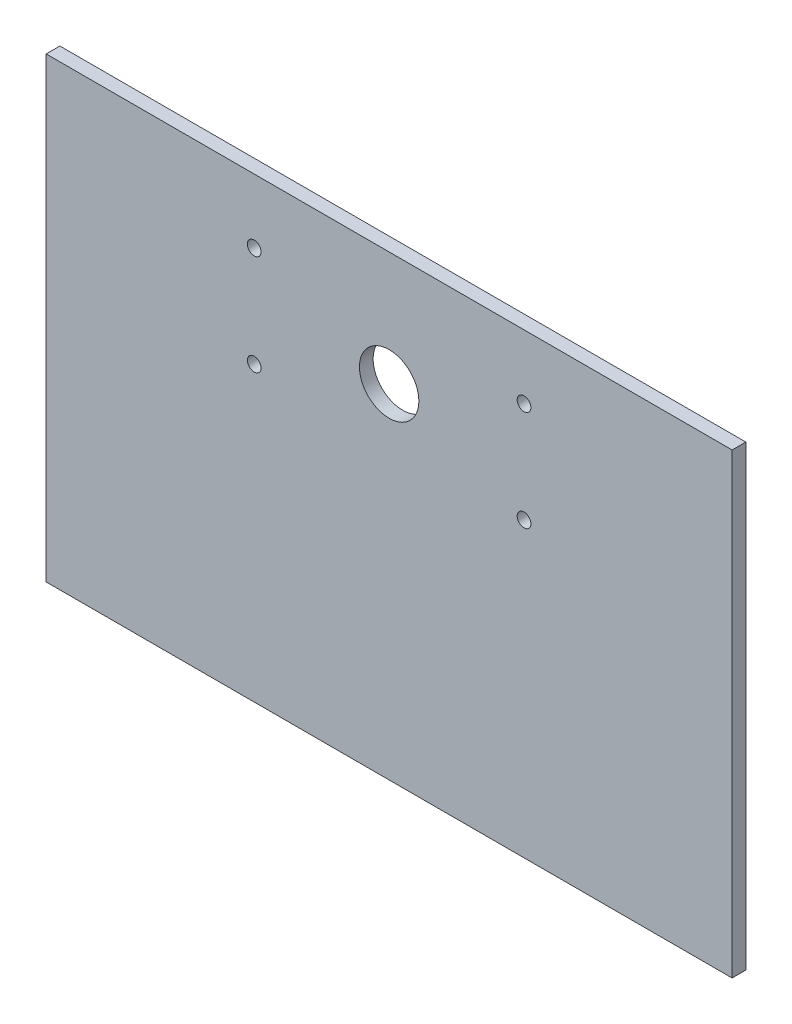
ISO-10303-21;
HEADER;
FILE_DESCRIPTION(('STEP AP214'),'2;1');
FILE_NAME('part.step','',(''),(''),'','','');
FILE_SCHEMA(('AUTOMOTIVE_DESIGN { 1 0 10303 214 1 1 1 1 }'));
ENDSEC;
DATA;
#1=APPLICATION_CONTEXT('core data for automotive mechanical design processes');
#2=APPLICATION_PROTOCOL_DEFINITION('international standard','automotive_design',2000,#1);
#3=PRODUCT_CONTEXT('',#1,'mechanical');
#4=PRODUCT('Part','Part','',(#3));
#5=PRODUCT_RELATED_PRODUCT_CATEGORY('part','',(#4));
#6=PRODUCT_DEFINITION_FORMATION('','',#4);
#7=PRODUCT_DEFINITION_CONTEXT('part definition',#1,'design');
#8=PRODUCT_DEFINITION('design','',#6,#7);
#9=PRODUCT_DEFINITION_SHAPE('','',#8);
#10=(LENGTH_UNIT() NAMED_UNIT(*) SI_UNIT(.MILLI.,.METRE.));
#11=(NAMED_UNIT(*) PLANE_ANGLE_UNIT() SI_UNIT($,.RADIAN.));
#12=(NAMED_UNIT(*) SI_UNIT($,.STERADIAN.) SOLID_ANGLE_UNIT());
#13=UNCERTAINTY_MEASURE_WITH_UNIT(LENGTH_MEASURE(1.E-05),#10,'distance_accuracy_value','');
#14=(GEOMETRIC_REPRESENTATION_CONTEXT(3) GLOBAL_UNCERTAINTY_ASSIGNED_CONTEXT((#13)) GLOBAL_UNIT_ASSIGNED_CONTEXT((#10,
#11,#12)) REPRESENTATION_CONTEXT('',''));
#15=CARTESIAN_POINT('',(0.,0.,0.));
#16=DIRECTION('',(0.,0.,1.));
#17=DIRECTION('',(1.,0.,0.));
#18=AXIS2_PLACEMENT_3D('',#15,#16,#17);
#19=CARTESIAN_POINT('',(0.,0.,3.));
#20=DIRECTION('',(0.,0.,1.));
#21=DIRECTION('',(1.,0.,0.));
#22=AXIS2_PLACEMENT_3D('',#19,#20,#21);
#23=PLANE('',#22);
#24=CARTESIAN_POINT('',(45.5,64.,3.));
#25=DIRECTION('',(0.,0.,1.));
#26=DIRECTION('',(1.,0.,0.));
#27=AXIS2_PLACEMENT_3D('',#24,#25,#26);
#28=CIRCLE('',#27,1.5);
#29=CARTESIAN_POINT('',(47.,64.,3.));
#30=VERTEX_POINT('',#29);
#31=EDGE_CURVE('E127',#30,#30,#28,.T.);
#32=ORIENTED_EDGE('',*,*,#31,.F.);
#33=EDGE_LOOP('',(#32));
#34=FACE_BOUND('',#33,.T.);
#35=CARTESIAN_POINT('',(104.5,86.,3.));
#36=DIRECTION('',(0.,0.,1.));
#37=DIRECTION('',(1.,0.,0.));
#38=AXIS2_PLACEMENT_3D('',#35,#36,#37);
#39=CIRCLE('',#38,1.5);
#40=CARTESIAN_POINT('',(106.,86.,3.));
#41=VERTEX_POINT('',#40);
#42=EDGE_CURVE('E115',#41,#41,#39,.T.);
#43=ORIENTED_EDGE('',*,*,#42,.F.);
#44=EDGE_LOOP('',(#43));
#45=FACE_BOUND('',#44,.T.);
#46=DIRECTION('',(0.,-1.,0.));
#47=VECTOR('',#46,1.);
#48=CARTESIAN_POINT('',(0.,100.,3.));
#49=LINE('',#48,#47);
#50=CARTESIAN_POINT('',(0.,100.,3.));
#51=VERTEX_POINT('',#50);
#52=CARTESIAN_POINT('',(0.,0.,3.));
#53=VERTEX_POINT('',#52);
#54=EDGE_CURVE('E85',#51,#53,#49,.T.);
#55=ORIENTED_EDGE('',*,*,#54,.T.);
#56=DIRECTION('',(1.,0.,0.));
#57=VECTOR('',#56,1.);
#58=CARTESIAN_POINT('',(0.,0.,3.));
#59=LINE('',#58,#57);
#60=CARTESIAN_POINT('',(150.,0.,3.));
#61=VERTEX_POINT('',#60);
#62=EDGE_CURVE('E80',#53,#61,#59,.T.);
#63=ORIENTED_EDGE('',*,*,#62,.T.);
#64=DIRECTION('',(0.,1.,0.));
#65=VECTOR('',#64,1.);
#66=CARTESIAN_POINT('',(150.,100.,3.));
#67=LINE('',#66,#65);
#68=CARTESIAN_POINT('',(150.,100.,3.));
#69=VERTEX_POINT('',#68);
#70=EDGE_CURVE('E83',#61,#69,#67,.T.);
#71=ORIENTED_EDGE('',*,*,#70,.T.);
#72=DIRECTION('',(-1.,0.,0.));
#73=VECTOR('',#72,1.);
#74=CARTESIAN_POINT('',(0.,100.,3.));
#75=LINE('',#74,#73);
#76=EDGE_CURVE('E50',#69,#51,#75,.T.);
#77=ORIENTED_EDGE('',*,*,#76,.T.);
#78=EDGE_LOOP('',(#55,#63,#71,#77));
#79=FACE_BOUND('',#78,.T.);
#80=CARTESIAN_POINT('',(75.,75.,3.));
#81=DIRECTION('',(0.,0.,1.));
#82=DIRECTION('',(1.,0.,0.));
#83=AXIS2_PLACEMENT_3D('',#80,#81,#82);
#84=CIRCLE('',#83,6.49999999999998);
#85=CARTESIAN_POINT('',(81.5,75.,3.));
#86=VERTEX_POINT('',#85);
#87=EDGE_CURVE('E100',#86,#86,#84,.T.);
#88=ORIENTED_EDGE('',*,*,#87,.F.);
#89=EDGE_LOOP('',(#88));
#90=FACE_BOUND('',#89,.T.);
#91=CARTESIAN_POINT('',(104.5,64.,3.));
#92=DIRECTION('',(0.,0.,1.));
#93=DIRECTION('',(-1.,0.,0.));
#94=AXIS2_PLACEMENT_3D('',#91,#92,#93);
#95=CIRCLE('',#94,1.5);
#96=CARTESIAN_POINT('',(103.,64.,3.));
#97=VERTEX_POINT('',#96);
#98=EDGE_CURVE('E121',#97,#97,#95,.T.);
#99=ORIENTED_EDGE('',*,*,#98,.F.);
#100=EDGE_LOOP('',(#99));
#101=FACE_BOUND('',#100,.T.);
#102=CARTESIAN_POINT('',(45.5,86.,3.));
#103=DIRECTION('',(0.,0.,1.));
#104=DIRECTION('',(-1.,0.,0.));
#105=AXIS2_PLACEMENT_3D('',#102,#103,#104);
#106=CIRCLE('',#105,1.5);
#107=CARTESIAN_POINT('',(44.,86.,3.));
#108=VERTEX_POINT('',#107);
#109=EDGE_CURVE('E133',#108,#108,#106,.T.);
#110=ORIENTED_EDGE('',*,*,#109,.F.);
#111=EDGE_LOOP('',(#110));
#112=FACE_BOUND('',#111,.T.);
#113=ADVANCED_FACE('F33',(#34,#45,#79,#90,#101,#112),#23,.T.);
#114=CARTESIAN_POINT('',(0.,0.,0.));
#115=DIRECTION('',(0.,0.,1.));
#116=DIRECTION('',(1.,0.,0.));
#117=AXIS2_PLACEMENT_3D('',#114,#115,#116);
#118=PLANE('',#117);
#119=DIRECTION('',(0.,-1.,0.));
#120=VECTOR('',#119,1.);
#121=CARTESIAN_POINT('',(0.,100.,0.));
#122=LINE('',#121,#120);
#123=CARTESIAN_POINT('',(0.,100.,0.));
#124=VERTEX_POINT('',#123);
#125=CARTESIAN_POINT('',(0.,0.,0.));
#126=VERTEX_POINT('',#125);
#127=EDGE_CURVE('E97',#124,#126,#122,.T.);
#128=ORIENTED_EDGE('',*,*,#127,.F.);
#129=DIRECTION('',(-1.,0.,0.));
#130=VECTOR('',#129,1.);
#131=CARTESIAN_POINT('',(0.,100.,0.));
#132=LINE('',#131,#130);
#133=CARTESIAN_POINT('',(150.,100.,0.));
#134=VERTEX_POINT('',#133);
#135=EDGE_CURVE('E73',#134,#124,#132,.T.);
#136=ORIENTED_EDGE('',*,*,#135,.F.);
#137=DIRECTION('',(0.,1.,0.));
#138=VECTOR('',#137,1.);
#139=CARTESIAN_POINT('',(150.,100.,0.));
#140=LINE('',#139,#138);
#141=CARTESIAN_POINT('',(150.,0.,0.));
#142=VERTEX_POINT('',#141);
#143=EDGE_CURVE('E67',#142,#134,#140,.T.);
#144=ORIENTED_EDGE('',*,*,#143,.F.);
#145=DIRECTION('',(1.,0.,0.));
#146=VECTOR('',#145,1.);
#147=CARTESIAN_POINT('',(0.,0.,0.));
#148=LINE('',#147,#146);
#149=EDGE_CURVE('E89',#126,#142,#148,.T.);
#150=ORIENTED_EDGE('',*,*,#149,.F.);
#151=EDGE_LOOP('',(#128,#136,#144,#150));
#152=FACE_BOUND('',#151,.T.);
#153=CARTESIAN_POINT('',(75.,75.,0.));
#154=DIRECTION('',(0.,0.,1.));
#155=DIRECTION('',(1.,0.,0.));
#156=AXIS2_PLACEMENT_3D('',#153,#154,#155);
#157=CIRCLE('',#156,6.49999999999998);
#158=CARTESIAN_POINT('',(81.5,75.,0.));
#159=VERTEX_POINT('',#158);
#160=EDGE_CURVE('E112',#159,#159,#157,.T.);
#161=ORIENTED_EDGE('',*,*,#160,.T.);
#162=EDGE_LOOP('',(#161));
#163=FACE_BOUND('',#162,.T.);
#164=CARTESIAN_POINT('',(104.5,86.,0.));
#165=DIRECTION('',(0.,0.,1.));
#166=DIRECTION('',(1.,0.,0.));
#167=AXIS2_PLACEMENT_3D('',#164,#165,#166);
#168=CIRCLE('',#167,1.5);
#169=CARTESIAN_POINT('',(106.,86.,0.));
#170=VERTEX_POINT('',#169);
#171=EDGE_CURVE('E118',#170,#170,#168,.T.);
#172=ORIENTED_EDGE('',*,*,#171,.T.);
#173=EDGE_LOOP('',(#172));
#174=FACE_BOUND('',#173,.T.);
#175=CARTESIAN_POINT('',(104.5,64.,0.));
#176=DIRECTION('',(0.,0.,1.));
#177=DIRECTION('',(-1.,0.,0.));
#178=AXIS2_PLACEMENT_3D('',#175,#176,#177);
#179=CIRCLE('',#178,1.5);
#180=CARTESIAN_POINT('',(103.,64.,0.));
#181=VERTEX_POINT('',#180);
#182=EDGE_CURVE('E124',#181,#181,#179,.T.);
#183=ORIENTED_EDGE('',*,*,#182,.T.);
#184=EDGE_LOOP('',(#183));
#185=FACE_BOUND('',#184,.T.);
#186=CARTESIAN_POINT('',(45.5,64.,0.));
#187=DIRECTION('',(0.,0.,1.));
#188=DIRECTION('',(1.,0.,0.));
#189=AXIS2_PLACEMENT_3D('',#186,#187,#188);
#190=CIRCLE('',#189,1.5);
#191=CARTESIAN_POINT('',(47.,64.,0.));
#192=VERTEX_POINT('',#191);
#193=EDGE_CURVE('E130',#192,#192,#190,.T.);
#194=ORIENTED_EDGE('',*,*,#193,.T.);
#195=EDGE_LOOP('',(#194));
#196=FACE_BOUND('',#195,.T.);
#197=CARTESIAN_POINT('',(45.5,86.,0.));
#198=DIRECTION('',(0.,0.,1.));
#199=DIRECTION('',(-1.,0.,0.));
#200=AXIS2_PLACEMENT_3D('',#197,#198,#199);
#201=CIRCLE('',#200,1.5);
#202=CARTESIAN_POINT('',(44.,86.,0.));
#203=VERTEX_POINT('',#202);
#204=EDGE_CURVE('E136',#203,#203,#201,.T.);
#205=ORIENTED_EDGE('',*,*,#204,.T.);
#206=EDGE_LOOP('',(#205));
#207=FACE_BOUND('',#206,.T.);
#208=ADVANCED_FACE('F108',(#152,#163,#174,#185,#196,#207),#118,.F.);
#209=CARTESIAN_POINT('',(0.,100.,3.));
#210=DIRECTION('',(1.,0.,0.));
#211=DIRECTION('',(0.,1.,0.));
#212=AXIS2_PLACEMENT_3D('',#209,#210,#211);
#213=PLANE('',#212);
#214=ORIENTED_EDGE('',*,*,#127,.T.);
#215=DIRECTION('',(0.,0.,-1.));
#216=VECTOR('',#215,1.);
#217=CARTESIAN_POINT('',(0.,0.,3.));
#218=LINE('',#217,#216);
#219=EDGE_CURVE('E11',#53,#126,#218,.T.);
#220=ORIENTED_EDGE('',*,*,#219,.F.);
#221=ORIENTED_EDGE('',*,*,#54,.F.);
#222=DIRECTION('',(0.,0.,-1.));
#223=VECTOR('',#222,1.);
#224=CARTESIAN_POINT('',(0.,100.,3.));
#225=LINE('',#224,#223);
#226=EDGE_CURVE('E93',#51,#124,#225,.T.);
#227=ORIENTED_EDGE('',*,*,#226,.T.);
#228=EDGE_LOOP('',(#214,#220,#221,#227));
#229=FACE_BOUND('',#228,.T.);
#230=ADVANCED_FACE('F35',(#229),#213,.F.);
#231=CARTESIAN_POINT('',(0.,0.,3.));
#232=DIRECTION('',(0.,1.,0.));
#233=DIRECTION('',(0.,0.,1.));
#234=AXIS2_PLACEMENT_3D('',#231,#232,#233);
#235=PLANE('',#234);
#236=ORIENTED_EDGE('',*,*,#149,.T.);
#237=DIRECTION('',(0.,0.,-1.));
#238=VECTOR('',#237,1.);
#239=CARTESIAN_POINT('',(150.,0.,3.));
#240=LINE('',#239,#238);
#241=EDGE_CURVE('E42',#61,#142,#240,.T.);
#242=ORIENTED_EDGE('',*,*,#241,.F.);
#243=ORIENTED_EDGE('',*,*,#62,.F.);
#244=ORIENTED_EDGE('',*,*,#219,.T.);
#245=EDGE_LOOP('',(#236,#242,#243,#244));
#246=FACE_BOUND('',#245,.T.);
#247=ADVANCED_FACE('F88',(#246),#235,.F.);
#248=CARTESIAN_POINT('',(150.,100.,3.));
#249=DIRECTION('',(-1.,0.,0.));
#250=DIRECTION('',(0.,-1.,0.));
#251=AXIS2_PLACEMENT_3D('',#248,#249,#250);
#252=PLANE('',#251);
#253=ORIENTED_EDGE('',*,*,#143,.T.);
#254=DIRECTION('',(0.,0.,-1.));
#255=VECTOR('',#254,1.);
#256=CARTESIAN_POINT('',(150.,100.,3.));
#257=LINE('',#256,#255);
#258=EDGE_CURVE('E90',#69,#134,#257,.T.);
#259=ORIENTED_EDGE('',*,*,#258,.F.);
#260=ORIENTED_EDGE('',*,*,#70,.F.);
#261=ORIENTED_EDGE('',*,*,#241,.T.);
#262=EDGE_LOOP('',(#253,#259,#260,#261));
#263=FACE_BOUND('',#262,.T.);
#264=ADVANCED_FACE('F91',(#263),#252,.F.);
#265=CARTESIAN_POINT('',(0.,100.,3.));
#266=DIRECTION('',(0.,-1.,0.));
#267=DIRECTION('',(0.,0.,-1.));
#268=AXIS2_PLACEMENT_3D('',#265,#266,#267);
#269=PLANE('',#268);
#270=ORIENTED_EDGE('',*,*,#135,.T.);
#271=ORIENTED_EDGE('',*,*,#226,.F.);
#272=ORIENTED_EDGE('',*,*,#76,.F.);
#273=ORIENTED_EDGE('',*,*,#258,.T.);
#274=EDGE_LOOP('',(#270,#271,#272,#273));
#275=FACE_BOUND('',#274,.T.);
#276=ADVANCED_FACE('F105',(#275),#269,.F.);
#277=CARTESIAN_POINT('',(75.,75.,3.));
#278=DIRECTION('',(0.,0.,-1.));
#279=DIRECTION('',(-1.,0.,0.));
#280=AXIS2_PLACEMENT_3D('',#277,#278,#279);
#281=CYLINDRICAL_SURFACE('',#280,6.49999999999998);
#282=ORIENTED_EDGE('',*,*,#87,.T.);
#283=EDGE_LOOP('',(#282));
#284=FACE_BOUND('',#283,.T.);
#285=ORIENTED_EDGE('',*,*,#160,.F.);
#286=EDGE_LOOP('',(#285));
#287=FACE_BOUND('',#286,.T.);
#288=ADVANCED_FACE('F155',(#284,#287),#281,.F.);
#289=CARTESIAN_POINT('',(104.5,86.,3.));
#290=DIRECTION('',(0.,0.,-1.));
#291=DIRECTION('',(-1.,0.,0.));
#292=AXIS2_PLACEMENT_3D('',#289,#290,#291);
#293=CYLINDRICAL_SURFACE('',#292,1.5);
#294=ORIENTED_EDGE('',*,*,#42,.T.);
#295=EDGE_LOOP('',(#294));
#296=FACE_BOUND('',#295,.T.);
#297=ORIENTED_EDGE('',*,*,#171,.F.);
#298=EDGE_LOOP('',(#297));
#299=FACE_BOUND('',#298,.T.);
#300=ADVANCED_FACE('F201',(#296,#299),#293,.F.);
#301=CARTESIAN_POINT('',(104.5,64.,3.));
#302=DIRECTION('',(0.,0.,-1.));
#303=DIRECTION('',(-1.,0.,0.));
#304=AXIS2_PLACEMENT_3D('',#301,#302,#303);
#305=CYLINDRICAL_SURFACE('',#304,1.5);
#306=ORIENTED_EDGE('',*,*,#98,.T.);
#307=EDGE_LOOP('',(#306));
#308=FACE_BOUND('',#307,.T.);
#309=ORIENTED_EDGE('',*,*,#182,.F.);
#310=EDGE_LOOP('',(#309));
#311=FACE_BOUND('',#310,.T.);
#312=ADVANCED_FACE('F209',(#308,#311),#305,.F.);
#313=CARTESIAN_POINT('',(45.5,64.,3.));
#314=DIRECTION('',(0.,0.,-1.));
#315=DIRECTION('',(-1.,0.,0.));
#316=AXIS2_PLACEMENT_3D('',#313,#314,#315);
#317=CYLINDRICAL_SURFACE('',#316,1.5);
#318=ORIENTED_EDGE('',*,*,#31,.T.);
#319=EDGE_LOOP('',(#318));
#320=FACE_BOUND('',#319,.T.);
#321=ORIENTED_EDGE('',*,*,#193,.F.);
#322=EDGE_LOOP('',(#321));
#323=FACE_BOUND('',#322,.T.);
#324=ADVANCED_FACE('F217',(#320,#323),#317,.F.);
#325=CARTESIAN_POINT('',(45.5,86.,3.));
#326=DIRECTION('',(0.,0.,-1.));
#327=DIRECTION('',(-1.,0.,0.));
#328=AXIS2_PLACEMENT_3D('',#325,#326,#327);
#329=CYLINDRICAL_SURFACE('',#328,1.5);
#330=ORIENTED_EDGE('',*,*,#109,.T.);
#331=EDGE_LOOP('',(#330));
#332=FACE_BOUND('',#331,.T.);
#333=ORIENTED_EDGE('',*,*,#204,.F.);
#334=EDGE_LOOP('',(#333));
#335=FACE_BOUND('',#334,.T.);
#336=ADVANCED_FACE('F142',(#332,#335),#329,.F.);
#337=CLOSED_SHELL('',(#113,#208,#230,#247,#264,#276,#288,#300,#312,#324,#336));
#338=MANIFOLD_SOLID_BREP('B2',#337);
#339=ADVANCED_BREP_SHAPE_REPRESENTATION('',(#18,#338),#14);
#340=SHAPE_DEFINITION_REPRESENTATION(#9,#339);
ENDSEC;
END-ISO-10303-21;
